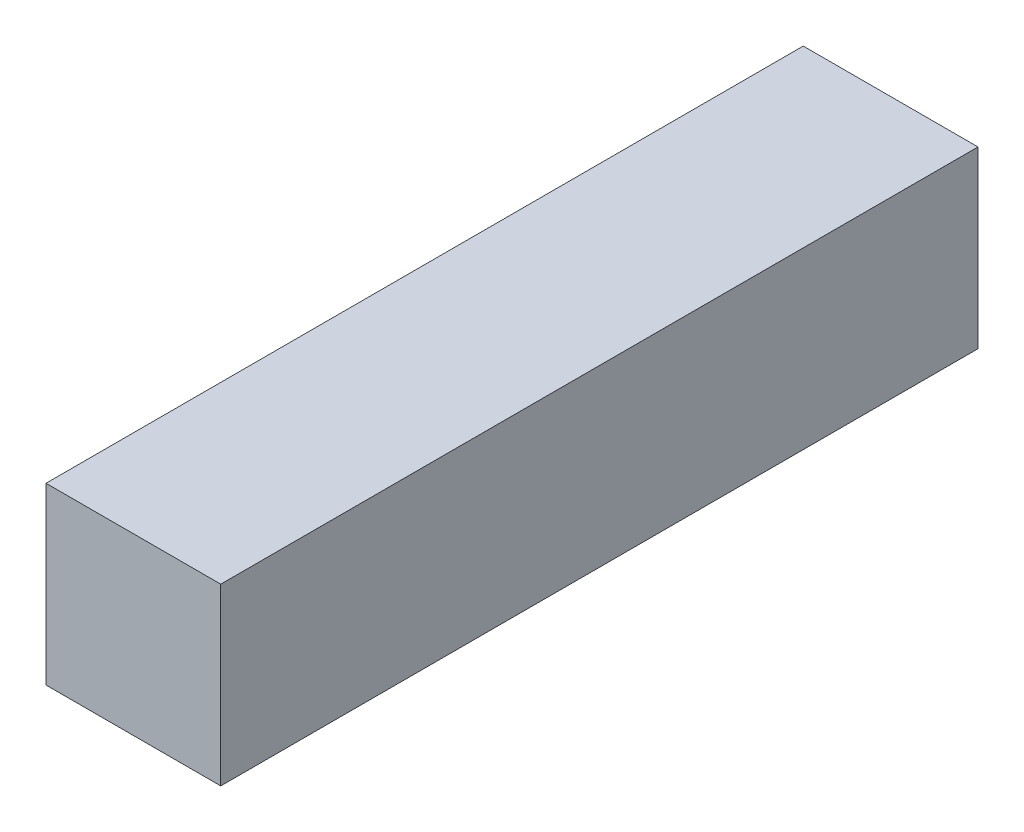
ISO-10303-21;
HEADER;
FILE_DESCRIPTION(('STEP AP214'),'2;1');
FILE_NAME('part.step','',(''),(''),'','','');
FILE_SCHEMA(('AUTOMOTIVE_DESIGN { 1 0 10303 214 1 1 1 1 }'));
ENDSEC;
DATA;
#1=APPLICATION_CONTEXT('core data for automotive mechanical design processes');
#2=APPLICATION_PROTOCOL_DEFINITION('international standard','automotive_design',2000,#1);
#3=PRODUCT_CONTEXT('',#1,'mechanical');
#4=PRODUCT('Part','Part','',(#3));
#5=PRODUCT_RELATED_PRODUCT_CATEGORY('part','',(#4));
#6=PRODUCT_DEFINITION_FORMATION('','',#4);
#7=PRODUCT_DEFINITION_CONTEXT('part definition',#1,'design');
#8=PRODUCT_DEFINITION('design','',#6,#7);
#9=PRODUCT_DEFINITION_SHAPE('','',#8);
#10=(LENGTH_UNIT() NAMED_UNIT(*) SI_UNIT(.MILLI.,.METRE.));
#11=(NAMED_UNIT(*) PLANE_ANGLE_UNIT() SI_UNIT($,.RADIAN.));
#12=(NAMED_UNIT(*) SI_UNIT($,.STERADIAN.) SOLID_ANGLE_UNIT());
#13=UNCERTAINTY_MEASURE_WITH_UNIT(LENGTH_MEASURE(1.E-05),#10,'distance_accuracy_value','');
#14=(GEOMETRIC_REPRESENTATION_CONTEXT(3) GLOBAL_UNCERTAINTY_ASSIGNED_CONTEXT((#13)) GLOBAL_UNIT_ASSIGNED_CONTEXT((#10,
#11,#12)) REPRESENTATION_CONTEXT('',''));
#15=CARTESIAN_POINT('',(0.,0.,0.));
#16=DIRECTION('',(0.,0.,1.));
#17=DIRECTION('',(1.,0.,0.));
#18=AXIS2_PLACEMENT_3D('',#15,#16,#17);
#19=CARTESIAN_POINT('',(15.,15.,65.));
#20=DIRECTION('',(-1.,0.,0.));
#21=DIRECTION('',(0.,0.,1.));
#22=AXIS2_PLACEMENT_3D('',#19,#20,#21);
#23=PLANE('',#22);
#24=DIRECTION('',(0.,1.,0.));
#25=VECTOR('',#24,1.);
#26=CARTESIAN_POINT('',(15.,15.,-65.));
#27=LINE('',#26,#25);
#28=CARTESIAN_POINT('',(15.,-15.,-65.));
#29=VERTEX_POINT('',#28);
#30=CARTESIAN_POINT('',(15.,15.,-65.));
#31=VERTEX_POINT('',#30);
#32=EDGE_CURVE('E95',#29,#31,#27,.T.);
#33=ORIENTED_EDGE('',*,*,#32,.T.);
#34=DIRECTION('',(0.,0.,-1.));
#35=VECTOR('',#34,1.);
#36=CARTESIAN_POINT('',(15.,15.,65.));
#37=LINE('',#36,#35);
#38=CARTESIAN_POINT('',(15.,15.,65.));
#39=VERTEX_POINT('',#38);
#40=EDGE_CURVE('E11',#39,#31,#37,.T.);
#41=ORIENTED_EDGE('',*,*,#40,.F.);
#42=DIRECTION('',(0.,1.,0.));
#43=VECTOR('',#42,1.);
#44=CARTESIAN_POINT('',(15.,15.,65.));
#45=LINE('',#44,#43);
#46=CARTESIAN_POINT('',(15.,-15.,65.));
#47=VERTEX_POINT('',#46);
#48=EDGE_CURVE('E83',#47,#39,#45,.T.);
#49=ORIENTED_EDGE('',*,*,#48,.F.);
#50=DIRECTION('',(0.,0.,-1.));
#51=VECTOR('',#50,1.);
#52=CARTESIAN_POINT('',(15.,-15.,65.));
#53=LINE('',#52,#51);
#54=EDGE_CURVE('E91',#47,#29,#53,.T.);
#55=ORIENTED_EDGE('',*,*,#54,.T.);
#56=EDGE_LOOP('',(#33,#41,#49,#55));
#57=FACE_BOUND('',#56,.T.);
#58=ADVANCED_FACE('F32',(#57),#23,.F.);
#59=CARTESIAN_POINT('',(-15.,15.,65.));
#60=DIRECTION('',(0.,-1.,0.));
#61=DIRECTION('',(0.,0.,-1.));
#62=AXIS2_PLACEMENT_3D('',#59,#60,#61);
#63=PLANE('',#62);
#64=DIRECTION('',(-1.,0.,0.));
#65=VECTOR('',#64,1.);
#66=CARTESIAN_POINT('',(-15.,15.,-65.));
#67=LINE('',#66,#65);
#68=CARTESIAN_POINT('',(-15.,15.,-65.));
#69=VERTEX_POINT('',#68);
#70=EDGE_CURVE('E87',#31,#69,#67,.T.);
#71=ORIENTED_EDGE('',*,*,#70,.T.);
#72=DIRECTION('',(0.,0.,-1.));
#73=VECTOR('',#72,1.);
#74=CARTESIAN_POINT('',(-15.,15.,65.));
#75=LINE('',#74,#73);
#76=CARTESIAN_POINT('',(-15.,15.,65.));
#77=VERTEX_POINT('',#76);
#78=EDGE_CURVE('E40',#77,#69,#75,.T.);
#79=ORIENTED_EDGE('',*,*,#78,.F.);
#80=DIRECTION('',(-1.,0.,0.));
#81=VECTOR('',#80,1.);
#82=CARTESIAN_POINT('',(-15.,15.,65.));
#83=LINE('',#82,#81);
#84=EDGE_CURVE('E78',#39,#77,#83,.T.);
#85=ORIENTED_EDGE('',*,*,#84,.F.);
#86=ORIENTED_EDGE('',*,*,#40,.T.);
#87=EDGE_LOOP('',(#71,#79,#85,#86));
#88=FACE_BOUND('',#87,.T.);
#89=ADVANCED_FACE('F86',(#88),#63,.F.);
#90=CARTESIAN_POINT('',(-15.,15.,65.));
#91=DIRECTION('',(1.,0.,0.));
#92=DIRECTION('',(0.,1.,0.));
#93=AXIS2_PLACEMENT_3D('',#90,#91,#92);
#94=PLANE('',#93);
#95=DIRECTION('',(0.,-1.,0.));
#96=VECTOR('',#95,1.);
#97=CARTESIAN_POINT('',(-15.,15.,-65.));
#98=LINE('',#97,#96);
#99=CARTESIAN_POINT('',(-15.,-15.,-65.));
#100=VERTEX_POINT('',#99);
#101=EDGE_CURVE('E65',#69,#100,#98,.T.);
#102=ORIENTED_EDGE('',*,*,#101,.T.);
#103=DIRECTION('',(0.,0.,-1.));
#104=VECTOR('',#103,1.);
#105=CARTESIAN_POINT('',(-15.,-15.,65.));
#106=LINE('',#105,#104);
#107=CARTESIAN_POINT('',(-15.,-15.,65.));
#108=VERTEX_POINT('',#107);
#109=EDGE_CURVE('E88',#108,#100,#106,.T.);
#110=ORIENTED_EDGE('',*,*,#109,.F.);
#111=DIRECTION('',(0.,-1.,0.));
#112=VECTOR('',#111,1.);
#113=CARTESIAN_POINT('',(-15.,15.,65.));
#114=LINE('',#113,#112);
#115=EDGE_CURVE('E81',#77,#108,#114,.T.);
#116=ORIENTED_EDGE('',*,*,#115,.F.);
#117=ORIENTED_EDGE('',*,*,#78,.T.);
#118=EDGE_LOOP('',(#102,#110,#116,#117));
#119=FACE_BOUND('',#118,.T.);
#120=ADVANCED_FACE('F89',(#119),#94,.F.);
#121=CARTESIAN_POINT('',(-15.,-15.,65.));
#122=DIRECTION('',(0.,1.,0.));
#123=DIRECTION('',(0.,0.,1.));
#124=AXIS2_PLACEMENT_3D('',#121,#122,#123);
#125=PLANE('',#124);
#126=DIRECTION('',(1.,0.,0.));
#127=VECTOR('',#126,1.);
#128=CARTESIAN_POINT('',(-15.,-15.,-65.));
#129=LINE('',#128,#127);
#130=EDGE_CURVE('E71',#100,#29,#129,.T.);
#131=ORIENTED_EDGE('',*,*,#130,.T.);
#132=ORIENTED_EDGE('',*,*,#54,.F.);
#133=DIRECTION('',(1.,0.,0.));
#134=VECTOR('',#133,1.);
#135=CARTESIAN_POINT('',(-15.,-15.,65.));
#136=LINE('',#135,#134);
#137=EDGE_CURVE('E48',#108,#47,#136,.T.);
#138=ORIENTED_EDGE('',*,*,#137,.F.);
#139=ORIENTED_EDGE('',*,*,#109,.T.);
#140=EDGE_LOOP('',(#131,#132,#138,#139));
#141=FACE_BOUND('',#140,.T.);
#142=ADVANCED_FACE('F102',(#141),#125,.F.);
#143=CARTESIAN_POINT('',(0.,0.,65.));
#144=DIRECTION('',(0.,0.,1.));
#145=DIRECTION('',(1.,0.,0.));
#146=AXIS2_PLACEMENT_3D('',#143,#144,#145);
#147=PLANE('',#146);
#148=ORIENTED_EDGE('',*,*,#48,.T.);
#149=ORIENTED_EDGE('',*,*,#84,.T.);
#150=ORIENTED_EDGE('',*,*,#115,.T.);
#151=ORIENTED_EDGE('',*,*,#137,.T.);
#152=EDGE_LOOP('',(#148,#149,#150,#151));
#153=FACE_BOUND('',#152,.T.);
#154=ADVANCED_FACE('F79',(#153),#147,.T.);
#155=CARTESIAN_POINT('',(0.,0.,-65.));
#156=DIRECTION('',(0.,0.,1.));
#157=DIRECTION('',(1.,0.,0.));
#158=AXIS2_PLACEMENT_3D('',#155,#156,#157);
#159=PLANE('',#158);
#160=ORIENTED_EDGE('',*,*,#32,.F.);
#161=ORIENTED_EDGE('',*,*,#130,.F.);
#162=ORIENTED_EDGE('',*,*,#101,.F.);
#163=ORIENTED_EDGE('',*,*,#70,.F.);
#164=EDGE_LOOP('',(#160,#161,#162,#163));
#165=FACE_BOUND('',#164,.T.);
#166=ADVANCED_FACE('F105',(#165),#159,.F.);
#167=CLOSED_SHELL('',(#58,#89,#120,#142,#154,#166));
#168=MANIFOLD_SOLID_BREP('B2',#167);
#169=ADVANCED_BREP_SHAPE_REPRESENTATION('',(#18,#168),#14);
#170=SHAPE_DEFINITION_REPRESENTATION(#9,#169);
ENDSEC;
END-ISO-10303-21;
